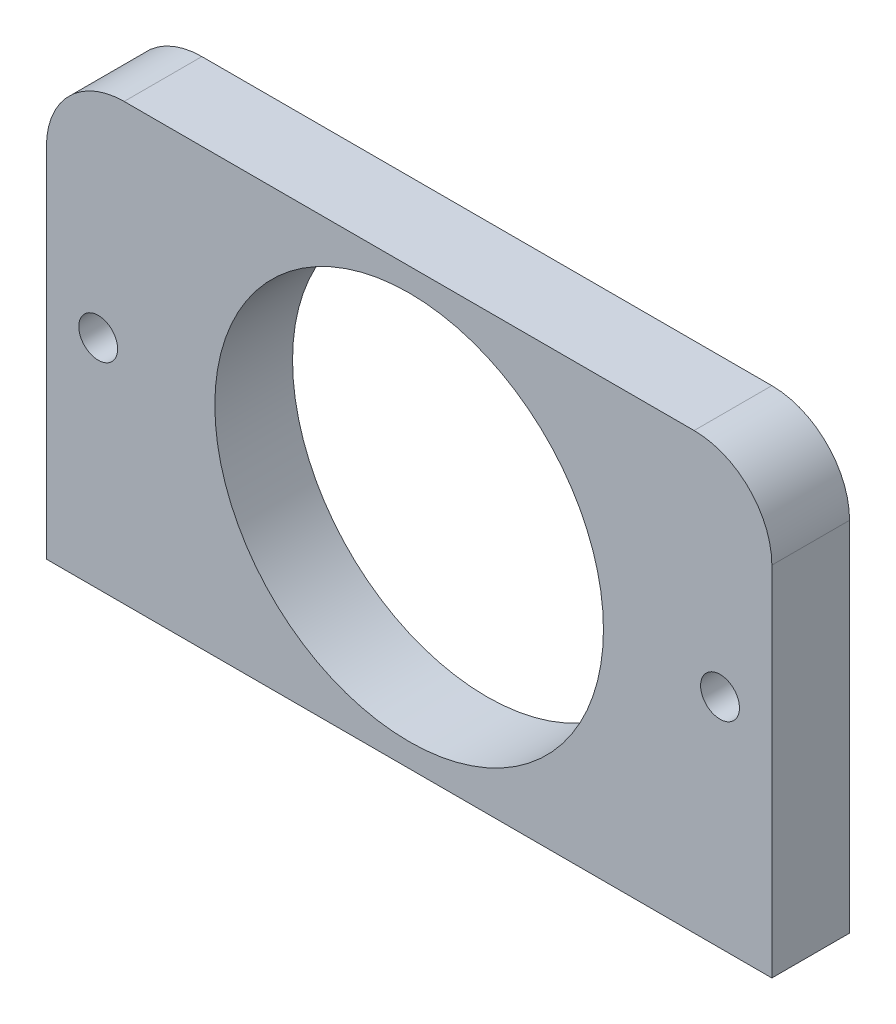
ISO-10303-21;
HEADER;
FILE_DESCRIPTION(('STEP AP214'),'2;1');
FILE_NAME('part.step','',(''),(''),'','','');
FILE_SCHEMA(('AUTOMOTIVE_DESIGN { 1 0 10303 214 1 1 1 1 }'));
ENDSEC;
DATA;
#1=APPLICATION_CONTEXT('core data for automotive mechanical design processes');
#2=APPLICATION_PROTOCOL_DEFINITION('international standard','automotive_design',2000,#1);
#3=PRODUCT_CONTEXT('',#1,'mechanical');
#4=PRODUCT('Part','Part','',(#3));
#5=PRODUCT_RELATED_PRODUCT_CATEGORY('part','',(#4));
#6=PRODUCT_DEFINITION_FORMATION('','',#4);
#7=PRODUCT_DEFINITION_CONTEXT('part definition',#1,'design');
#8=PRODUCT_DEFINITION('design','',#6,#7);
#9=PRODUCT_DEFINITION_SHAPE('','',#8);
#10=(LENGTH_UNIT() NAMED_UNIT(*) SI_UNIT(.MILLI.,.METRE.));
#11=(NAMED_UNIT(*) PLANE_ANGLE_UNIT() SI_UNIT($,.RADIAN.));
#12=(NAMED_UNIT(*) SI_UNIT($,.STERADIAN.) SOLID_ANGLE_UNIT());
#13=UNCERTAINTY_MEASURE_WITH_UNIT(LENGTH_MEASURE(1.E-05),#10,'distance_accuracy_value','');
#14=(GEOMETRIC_REPRESENTATION_CONTEXT(3) GLOBAL_UNCERTAINTY_ASSIGNED_CONTEXT((#13)) GLOBAL_UNIT_ASSIGNED_CONTEXT((#10,
#11,#12)) REPRESENTATION_CONTEXT('',''));
#15=CARTESIAN_POINT('',(0.,0.,0.));
#16=DIRECTION('',(0.,0.,1.));
#17=DIRECTION('',(1.,0.,0.));
#18=AXIS2_PLACEMENT_3D('',#15,#16,#17);
#19=CARTESIAN_POINT('',(-55.,27.,15.));
#20=DIRECTION('',(0.,0.,-1.));
#21=DIRECTION('',(-1.,0.,0.));
#22=AXIS2_PLACEMENT_3D('',#19,#20,#21);
#23=PLANE('',#22);
#24=DIRECTION('',(0.,-1.,0.));
#25=VECTOR('',#24,1.);
#26=CARTESIAN_POINT('',(-70.,-42.,15.));
#27=LINE('',#26,#25);
#28=CARTESIAN_POINT('',(-70.,27.,15.));
#29=VERTEX_POINT('',#28);
#30=CARTESIAN_POINT('',(-70.,-42.,15.));
#31=VERTEX_POINT('',#30);
#32=EDGE_CURVE('E129',#29,#31,#27,.T.);
#33=ORIENTED_EDGE('',*,*,#32,.T.);
#34=DIRECTION('',(1.,0.,0.));
#35=VECTOR('',#34,1.);
#36=CARTESIAN_POINT('',(-70.,-42.,15.));
#37=LINE('',#36,#35);
#38=CARTESIAN_POINT('',(70.,-42.,15.));
#39=VERTEX_POINT('',#38);
#40=EDGE_CURVE('E87',#31,#39,#37,.T.);
#41=ORIENTED_EDGE('',*,*,#40,.T.);
#42=DIRECTION('',(0.,1.,0.));
#43=VECTOR('',#42,1.);
#44=CARTESIAN_POINT('',(70.,-42.,15.));
#45=LINE('',#44,#43);
#46=CARTESIAN_POINT('',(70.,27.,15.));
#47=VERTEX_POINT('',#46);
#48=EDGE_CURVE('E100',#39,#47,#45,.T.);
#49=ORIENTED_EDGE('',*,*,#48,.T.);
#50=CARTESIAN_POINT('',(55.,27.,15.));
#51=DIRECTION('',(0.,0.,1.));
#52=DIRECTION('',(-1.,0.,0.));
#53=AXIS2_PLACEMENT_3D('',#50,#51,#52);
#54=CIRCLE('',#53,15.);
#55=CARTESIAN_POINT('',(55.,42.,15.));
#56=VERTEX_POINT('',#55);
#57=EDGE_CURVE('E94',#47,#56,#54,.T.);
#58=ORIENTED_EDGE('',*,*,#57,.T.);
#59=DIRECTION('',(-1.,0.,0.));
#60=VECTOR('',#59,1.);
#61=CARTESIAN_POINT('',(-55.,42.,15.));
#62=LINE('',#61,#60);
#63=CARTESIAN_POINT('',(-55.,42.,15.));
#64=VERTEX_POINT('',#63);
#65=EDGE_CURVE('E98',#56,#64,#62,.T.);
#66=ORIENTED_EDGE('',*,*,#65,.T.);
#67=CARTESIAN_POINT('',(-55.,27.,15.));
#68=DIRECTION('',(0.,0.,1.));
#69=DIRECTION('',(-1.,0.,0.));
#70=AXIS2_PLACEMENT_3D('',#67,#68,#69);
#71=CIRCLE('',#70,15.);
#72=EDGE_CURVE('E50',#64,#29,#71,.T.);
#73=ORIENTED_EDGE('',*,*,#72,.T.);
#74=EDGE_LOOP('',(#33,#41,#49,#58,#66,#73));
#75=FACE_BOUND('',#74,.T.);
#76=CARTESIAN_POINT('',(0.,0.,15.));
#77=DIRECTION('',(0.,0.,1.));
#78=DIRECTION('',(1.,0.,0.));
#79=AXIS2_PLACEMENT_3D('',#76,#77,#78);
#80=CIRCLE('',#79,37.5);
#81=CARTESIAN_POINT('',(37.5,0.,15.));
#82=VERTEX_POINT('',#81);
#83=EDGE_CURVE('E122',#82,#82,#80,.T.);
#84=ORIENTED_EDGE('',*,*,#83,.F.);
#85=EDGE_LOOP('',(#84));
#86=FACE_BOUND('',#85,.T.);
#87=CARTESIAN_POINT('',(-60.,0.,15.));
#88=DIRECTION('',(0.,0.,1.));
#89=DIRECTION('',(1.,0.,0.));
#90=AXIS2_PLACEMENT_3D('',#87,#88,#89);
#91=CIRCLE('',#90,3.75);
#92=CARTESIAN_POINT('',(-56.25,0.,15.));
#93=VERTEX_POINT('',#92);
#94=EDGE_CURVE('E183',#93,#93,#91,.T.);
#95=ORIENTED_EDGE('',*,*,#94,.F.);
#96=EDGE_LOOP('',(#95));
#97=FACE_BOUND('',#96,.T.);
#98=CARTESIAN_POINT('',(60.,0.,15.));
#99=DIRECTION('',(0.,0.,1.));
#100=DIRECTION('',(-1.,0.,0.));
#101=AXIS2_PLACEMENT_3D('',#98,#99,#100);
#102=CIRCLE('',#101,3.75);
#103=CARTESIAN_POINT('',(56.25,0.,15.));
#104=VERTEX_POINT('',#103);
#105=EDGE_CURVE('E174',#104,#104,#102,.T.);
#106=ORIENTED_EDGE('',*,*,#105,.F.);
#107=EDGE_LOOP('',(#106));
#108=FACE_BOUND('',#107,.T.);
#109=ADVANCED_FACE('F33',(#75,#86,#97,#108),#23,.F.);
#110=CARTESIAN_POINT('',(-55.,27.,0.));
#111=DIRECTION('',(0.,0.,-1.));
#112=DIRECTION('',(-1.,0.,0.));
#113=AXIS2_PLACEMENT_3D('',#110,#111,#112);
#114=PLANE('',#113);
#115=CARTESIAN_POINT('',(-60.,0.,0.));
#116=DIRECTION('',(0.,0.,1.));
#117=DIRECTION('',(1.,0.,0.));
#118=AXIS2_PLACEMENT_3D('',#115,#116,#117);
#119=CIRCLE('',#118,3.75);
#120=CARTESIAN_POINT('',(-56.25,0.,0.));
#121=VERTEX_POINT('',#120);
#122=EDGE_CURVE('E180',#121,#121,#119,.T.);
#123=ORIENTED_EDGE('',*,*,#122,.T.);
#124=EDGE_LOOP('',(#123));
#125=FACE_BOUND('',#124,.T.);
#126=DIRECTION('',(0.,-1.,0.));
#127=VECTOR('',#126,1.);
#128=CARTESIAN_POINT('',(-70.,-42.,0.));
#129=LINE('',#128,#127);
#130=CARTESIAN_POINT('',(-70.,27.,0.));
#131=VERTEX_POINT('',#130);
#132=CARTESIAN_POINT('',(-70.,-42.,0.));
#133=VERTEX_POINT('',#132);
#134=EDGE_CURVE('E118',#131,#133,#129,.T.);
#135=ORIENTED_EDGE('',*,*,#134,.F.);
#136=CARTESIAN_POINT('',(-55.,27.,0.));
#137=DIRECTION('',(0.,0.,1.));
#138=DIRECTION('',(-1.,0.,0.));
#139=AXIS2_PLACEMENT_3D('',#136,#137,#138);
#140=CIRCLE('',#139,15.);
#141=CARTESIAN_POINT('',(-55.,42.,0.));
#142=VERTEX_POINT('',#141);
#143=EDGE_CURVE('E79',#142,#131,#140,.T.);
#144=ORIENTED_EDGE('',*,*,#143,.F.);
#145=DIRECTION('',(-1.,0.,0.));
#146=VECTOR('',#145,1.);
#147=CARTESIAN_POINT('',(-55.,42.,0.));
#148=LINE('',#147,#146);
#149=CARTESIAN_POINT('',(55.,42.,0.));
#150=VERTEX_POINT('',#149);
#151=EDGE_CURVE('E73',#150,#142,#148,.T.);
#152=ORIENTED_EDGE('',*,*,#151,.F.);
#153=CARTESIAN_POINT('',(55.,27.,0.));
#154=DIRECTION('',(0.,0.,1.));
#155=DIRECTION('',(-1.,0.,0.));
#156=AXIS2_PLACEMENT_3D('',#153,#154,#155);
#157=CIRCLE('',#156,15.);
#158=CARTESIAN_POINT('',(70.,27.,0.));
#159=VERTEX_POINT('',#158);
#160=EDGE_CURVE('E108',#159,#150,#157,.T.);
#161=ORIENTED_EDGE('',*,*,#160,.F.);
#162=DIRECTION('',(0.,1.,0.));
#163=VECTOR('',#162,1.);
#164=CARTESIAN_POINT('',(70.,-42.,0.));
#165=LINE('',#164,#163);
#166=CARTESIAN_POINT('',(70.,-42.,0.));
#167=VERTEX_POINT('',#166);
#168=EDGE_CURVE('E124',#167,#159,#165,.T.);
#169=ORIENTED_EDGE('',*,*,#168,.F.);
#170=DIRECTION('',(1.,0.,0.));
#171=VECTOR('',#170,1.);
#172=CARTESIAN_POINT('',(-70.,-42.,0.));
#173=LINE('',#172,#171);
#174=EDGE_CURVE('E121',#133,#167,#173,.T.);
#175=ORIENTED_EDGE('',*,*,#174,.F.);
#176=EDGE_LOOP('',(#135,#144,#152,#161,#169,#175));
#177=FACE_BOUND('',#176,.T.);
#178=CARTESIAN_POINT('',(0.,0.,0.));
#179=DIRECTION('',(0.,0.,1.));
#180=DIRECTION('',(1.,0.,0.));
#181=AXIS2_PLACEMENT_3D('',#178,#179,#180);
#182=CIRCLE('',#181,37.5);
#183=CARTESIAN_POINT('',(37.5,0.,0.));
#184=VERTEX_POINT('',#183);
#185=EDGE_CURVE('E186',#184,#184,#182,.T.);
#186=ORIENTED_EDGE('',*,*,#185,.T.);
#187=EDGE_LOOP('',(#186));
#188=FACE_BOUND('',#187,.T.);
#189=CARTESIAN_POINT('',(60.,0.,0.));
#190=DIRECTION('',(0.,0.,1.));
#191=DIRECTION('',(-1.,0.,0.));
#192=AXIS2_PLACEMENT_3D('',#189,#190,#191);
#193=CIRCLE('',#192,3.75);
#194=CARTESIAN_POINT('',(56.25,0.,0.));
#195=VERTEX_POINT('',#194);
#196=EDGE_CURVE('E177',#195,#195,#193,.T.);
#197=ORIENTED_EDGE('',*,*,#196,.T.);
#198=EDGE_LOOP('',(#197));
#199=FACE_BOUND('',#198,.T.);
#200=ADVANCED_FACE('F138',(#125,#177,#188,#199),#114,.T.);
#201=CARTESIAN_POINT('',(-70.,-42.,15.));
#202=DIRECTION('',(1.,0.,0.));
#203=DIRECTION('',(0.,0.,-1.));
#204=AXIS2_PLACEMENT_3D('',#201,#202,#203);
#205=PLANE('',#204);
#206=ORIENTED_EDGE('',*,*,#134,.T.);
#207=DIRECTION('',(0.,0.,-1.));
#208=VECTOR('',#207,1.);
#209=CARTESIAN_POINT('',(-70.,-42.,15.));
#210=LINE('',#209,#208);
#211=EDGE_CURVE('E11',#31,#133,#210,.T.);
#212=ORIENTED_EDGE('',*,*,#211,.F.);
#213=ORIENTED_EDGE('',*,*,#32,.F.);
#214=DIRECTION('',(0.,0.,-1.));
#215=VECTOR('',#214,1.);
#216=CARTESIAN_POINT('',(-70.,27.,15.));
#217=LINE('',#216,#215);
#218=EDGE_CURVE('E114',#29,#131,#217,.T.);
#219=ORIENTED_EDGE('',*,*,#218,.T.);
#220=EDGE_LOOP('',(#206,#212,#213,#219));
#221=FACE_BOUND('',#220,.T.);
#222=ADVANCED_FACE('F35',(#221),#205,.F.);
#223=CARTESIAN_POINT('',(-70.,-42.,15.));
#224=DIRECTION('',(0.,1.,0.));
#225=DIRECTION('',(-1.,0.,0.));
#226=AXIS2_PLACEMENT_3D('',#223,#224,#225);
#227=PLANE('',#226);
#228=ORIENTED_EDGE('',*,*,#174,.T.);
#229=DIRECTION('',(0.,0.,-1.));
#230=VECTOR('',#229,1.);
#231=CARTESIAN_POINT('',(70.,-42.,15.));
#232=LINE('',#231,#230);
#233=EDGE_CURVE('E42',#39,#167,#232,.T.);
#234=ORIENTED_EDGE('',*,*,#233,.F.);
#235=ORIENTED_EDGE('',*,*,#40,.F.);
#236=ORIENTED_EDGE('',*,*,#211,.T.);
#237=EDGE_LOOP('',(#228,#234,#235,#236));
#238=FACE_BOUND('',#237,.T.);
#239=ADVANCED_FACE('F237',(#238),#227,.F.);
#240=CARTESIAN_POINT('',(70.,-42.,15.));
#241=DIRECTION('',(-1.,0.,0.));
#242=DIRECTION('',(0.,-1.,0.));
#243=AXIS2_PLACEMENT_3D('',#240,#241,#242);
#244=PLANE('',#243);
#245=ORIENTED_EDGE('',*,*,#168,.T.);
#246=DIRECTION('',(0.,0.,-1.));
#247=VECTOR('',#246,1.);
#248=CARTESIAN_POINT('',(70.,27.,15.));
#249=LINE('',#248,#247);
#250=EDGE_CURVE('E109',#47,#159,#249,.T.);
#251=ORIENTED_EDGE('',*,*,#250,.F.);
#252=ORIENTED_EDGE('',*,*,#48,.F.);
#253=ORIENTED_EDGE('',*,*,#233,.T.);
#254=EDGE_LOOP('',(#245,#251,#252,#253));
#255=FACE_BOUND('',#254,.T.);
#256=ADVANCED_FACE('F135',(#255),#244,.F.);
#257=CARTESIAN_POINT('',(55.,27.,15.));
#258=DIRECTION('',(0.,0.,-1.));
#259=DIRECTION('',(-1.,0.,0.));
#260=AXIS2_PLACEMENT_3D('',#257,#258,#259);
#261=CYLINDRICAL_SURFACE('',#260,15.);
#262=ORIENTED_EDGE('',*,*,#160,.T.);
#263=DIRECTION('',(0.,0.,-1.));
#264=VECTOR('',#263,1.);
#265=CARTESIAN_POINT('',(55.,42.,15.));
#266=LINE('',#265,#264);
#267=EDGE_CURVE('E105',#56,#150,#266,.T.);
#268=ORIENTED_EDGE('',*,*,#267,.F.);
#269=ORIENTED_EDGE('',*,*,#57,.F.);
#270=ORIENTED_EDGE('',*,*,#250,.T.);
#271=EDGE_LOOP('',(#262,#268,#269,#270));
#272=FACE_BOUND('',#271,.T.);
#273=ADVANCED_FACE('F106',(#272),#261,.T.);
#274=CARTESIAN_POINT('',(-55.,42.,15.));
#275=DIRECTION('',(0.,-1.,0.));
#276=DIRECTION('',(1.,0.,0.));
#277=AXIS2_PLACEMENT_3D('',#274,#275,#276);
#278=PLANE('',#277);
#279=ORIENTED_EDGE('',*,*,#151,.T.);
#280=DIRECTION('',(0.,0.,-1.));
#281=VECTOR('',#280,1.);
#282=CARTESIAN_POINT('',(-55.,42.,15.));
#283=LINE('',#282,#281);
#284=EDGE_CURVE('E110',#64,#142,#283,.T.);
#285=ORIENTED_EDGE('',*,*,#284,.F.);
#286=ORIENTED_EDGE('',*,*,#65,.F.);
#287=ORIENTED_EDGE('',*,*,#267,.T.);
#288=EDGE_LOOP('',(#279,#285,#286,#287));
#289=FACE_BOUND('',#288,.T.);
#290=ADVANCED_FACE('F112',(#289),#278,.F.);
#291=CARTESIAN_POINT('',(-55.,27.,15.));
#292=DIRECTION('',(0.,0.,-1.));
#293=DIRECTION('',(-1.,0.,0.));
#294=AXIS2_PLACEMENT_3D('',#291,#292,#293);
#295=CYLINDRICAL_SURFACE('',#294,15.);
#296=ORIENTED_EDGE('',*,*,#143,.T.);
#297=ORIENTED_EDGE('',*,*,#218,.F.);
#298=ORIENTED_EDGE('',*,*,#72,.F.);
#299=ORIENTED_EDGE('',*,*,#284,.T.);
#300=EDGE_LOOP('',(#296,#297,#298,#299));
#301=FACE_BOUND('',#300,.T.);
#302=ADVANCED_FACE('F143',(#301),#295,.T.);
#303=CARTESIAN_POINT('',(0.,0.,15.));
#304=DIRECTION('',(0.,0.,-1.));
#305=DIRECTION('',(-1.,0.,0.));
#306=AXIS2_PLACEMENT_3D('',#303,#304,#305);
#307=CYLINDRICAL_SURFACE('',#306,37.5);
#308=ORIENTED_EDGE('',*,*,#83,.T.);
#309=EDGE_LOOP('',(#308));
#310=FACE_BOUND('',#309,.T.);
#311=ORIENTED_EDGE('',*,*,#185,.F.);
#312=EDGE_LOOP('',(#311));
#313=FACE_BOUND('',#312,.T.);
#314=ADVANCED_FACE('F145',(#310,#313),#307,.F.);
#315=CARTESIAN_POINT('',(-60.,0.,15.));
#316=DIRECTION('',(0.,0.,-1.));
#317=DIRECTION('',(-1.,0.,0.));
#318=AXIS2_PLACEMENT_3D('',#315,#316,#317);
#319=CYLINDRICAL_SURFACE('',#318,3.75);
#320=ORIENTED_EDGE('',*,*,#94,.T.);
#321=EDGE_LOOP('',(#320));
#322=FACE_BOUND('',#321,.T.);
#323=ORIENTED_EDGE('',*,*,#122,.F.);
#324=EDGE_LOOP('',(#323));
#325=FACE_BOUND('',#324,.T.);
#326=ADVANCED_FACE('F151',(#322,#325),#319,.F.);
#327=CARTESIAN_POINT('',(60.,0.,15.));
#328=DIRECTION('',(0.,0.,-1.));
#329=DIRECTION('',(-1.,0.,0.));
#330=AXIS2_PLACEMENT_3D('',#327,#328,#329);
#331=CYLINDRICAL_SURFACE('',#330,3.75);
#332=ORIENTED_EDGE('',*,*,#105,.T.);
#333=EDGE_LOOP('',(#332));
#334=FACE_BOUND('',#333,.T.);
#335=ORIENTED_EDGE('',*,*,#196,.F.);
#336=EDGE_LOOP('',(#335));
#337=FACE_BOUND('',#336,.T.);
#338=ADVANCED_FACE('F165',(#334,#337),#331,.F.);
#339=CLOSED_SHELL('',(#109,#200,#222,#239,#256,#273,#290,#302,#314,#326,#338));
#340=MANIFOLD_SOLID_BREP('B2',#339);
#341=ADVANCED_BREP_SHAPE_REPRESENTATION('',(#18,#340),#14);
#342=SHAPE_DEFINITION_REPRESENTATION(#9,#341);
ENDSEC;
END-ISO-10303-21;
